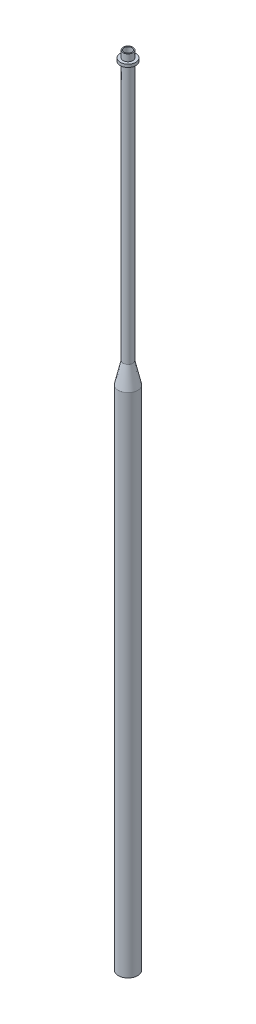
ISO-10303-21;
HEADER;
FILE_DESCRIPTION(('STEP AP214'),'2;1');
FILE_NAME('part.step','',(''),(''),'','','');
FILE_SCHEMA(('AUTOMOTIVE_DESIGN { 1 0 10303 214 1 1 1 1 }'));
ENDSEC;
DATA;
#1=APPLICATION_CONTEXT('core data for automotive mechanical design processes');
#2=APPLICATION_PROTOCOL_DEFINITION('international standard','automotive_design',2000,#1);
#3=PRODUCT_CONTEXT('',#1,'mechanical');
#4=PRODUCT('Part','Part','',(#3));
#5=PRODUCT_RELATED_PRODUCT_CATEGORY('part','',(#4));
#6=PRODUCT_DEFINITION_FORMATION('','',#4);
#7=PRODUCT_DEFINITION_CONTEXT('part definition',#1,'design');
#8=PRODUCT_DEFINITION('design','',#6,#7);
#9=PRODUCT_DEFINITION_SHAPE('','',#8);
#10=(LENGTH_UNIT() NAMED_UNIT(*) SI_UNIT(.MILLI.,.METRE.));
#11=(NAMED_UNIT(*) PLANE_ANGLE_UNIT() SI_UNIT($,.RADIAN.));
#12=(NAMED_UNIT(*) SI_UNIT($,.STERADIAN.) SOLID_ANGLE_UNIT());
#13=UNCERTAINTY_MEASURE_WITH_UNIT(LENGTH_MEASURE(1.E-05),#10,'distance_accuracy_value','');
#14=(GEOMETRIC_REPRESENTATION_CONTEXT(3) GLOBAL_UNCERTAINTY_ASSIGNED_CONTEXT((#13)) GLOBAL_UNIT_ASSIGNED_CONTEXT((#10,
#11,#12)) REPRESENTATION_CONTEXT('',''));
#15=CARTESIAN_POINT('',(0.,0.,0.));
#16=DIRECTION('',(0.,0.,1.));
#17=DIRECTION('',(1.,0.,0.));
#18=AXIS2_PLACEMENT_3D('',#15,#16,#17);
#19=CARTESIAN_POINT('',(0.,820.,0.));
#20=DIRECTION('',(0.,-1.,0.));
#21=DIRECTION('',(0.,0.,-1.));
#22=AXIS2_PLACEMENT_3D('',#19,#20,#21);
#23=CYLINDRICAL_SURFACE('',#22,5.);
#24=CARTESIAN_POINT('',(0.,543.314758742843,0.));
#25=DIRECTION('',(0.,1.,0.));
#26=DIRECTION('',(0.,0.,1.));
#27=AXIS2_PLACEMENT_3D('',#24,#25,#26);
#28=CIRCLE('',#27,5.);
#29=CARTESIAN_POINT('',(0.,543.314758742843,-5.00000000000001));
#30=VERTEX_POINT('',#29);
#31=EDGE_CURVE('E51',#30,#30,#28,.T.);
#32=ORIENTED_EDGE('',*,*,#31,.T.);
#33=EDGE_LOOP('',(#32));
#34=FACE_BOUND('',#33,.T.);
#35=CARTESIAN_POINT('',(0.,810.,0.));
#36=DIRECTION('',(0.,1.,0.));
#37=DIRECTION('',(0.,0.,1.));
#38=AXIS2_PLACEMENT_3D('',#35,#36,#37);
#39=CIRCLE('',#38,5.);
#40=CARTESIAN_POINT('',(0.,810.,5.));
#41=VERTEX_POINT('',#40);
#42=EDGE_CURVE('E10',#41,#41,#39,.T.);
#43=ORIENTED_EDGE('',*,*,#42,.F.);
#44=EDGE_LOOP('',(#43));
#45=FACE_BOUND('',#44,.T.);
#46=ADVANCED_FACE('F37',(#34,#45),#23,.T.);
#47=CARTESIAN_POINT('',(0.,813.,0.));
#48=DIRECTION('',(0.,1.,0.));
#49=DIRECTION('',(0.,0.,1.));
#50=AXIS2_PLACEMENT_3D('',#47,#48,#49);
#51=CIRCLE('',#50,5.);
#52=CARTESIAN_POINT('',(0.,813.,5.));
#53=VERTEX_POINT('',#52);
#54=EDGE_CURVE('E41',#53,#53,#51,.T.);
#55=ORIENTED_EDGE('',*,*,#54,.T.);
#56=EDGE_LOOP('',(#55));
#57=FACE_BOUND('',#56,.T.);
#58=CARTESIAN_POINT('',(0.,820.,0.));
#59=DIRECTION('',(0.,1.,0.));
#60=DIRECTION('',(0.,0.,1.));
#61=AXIS2_PLACEMENT_3D('',#58,#59,#60);
#62=CIRCLE('',#61,5.);
#63=CARTESIAN_POINT('',(0.,820.,5.));
#64=VERTEX_POINT('',#63);
#65=EDGE_CURVE('E57',#64,#64,#62,.T.);
#66=ORIENTED_EDGE('',*,*,#65,.F.);
#67=EDGE_LOOP('',(#66));
#68=FACE_BOUND('',#67,.T.);
#69=ADVANCED_FACE('F86',(#57,#68),#23,.T.);
#70=CARTESIAN_POINT('',(0.,820.,0.));
#71=DIRECTION('',(0.,1.,0.));
#72=DIRECTION('',(0.,0.,1.));
#73=AXIS2_PLACEMENT_3D('',#70,#71,#72);
#74=PLANE('',#73);
#75=CARTESIAN_POINT('',(0.,820.,0.));
#76=DIRECTION('',(0.,1.,0.));
#77=DIRECTION('',(0.,0.,1.));
#78=AXIS2_PLACEMENT_3D('',#75,#76,#77);
#79=CIRCLE('',#78,4.);
#80=CARTESIAN_POINT('',(0.,820.,4.));
#81=VERTEX_POINT('',#80);
#82=EDGE_CURVE('E66',#81,#81,#79,.T.);
#83=ORIENTED_EDGE('',*,*,#82,.F.);
#84=EDGE_LOOP('',(#83));
#85=FACE_BOUND('',#84,.T.);
#86=ORIENTED_EDGE('',*,*,#65,.T.);
#87=EDGE_LOOP('',(#86));
#88=FACE_BOUND('',#87,.T.);
#89=ADVANCED_FACE('F107',(#85,#88),#74,.T.);
#90=CARTESIAN_POINT('',(0.,500.,0.));
#91=DIRECTION('',(0.,-1.,0.));
#92=DIRECTION('',(0.,0.,-1.));
#93=AXIS2_PLACEMENT_3D('',#90,#91,#92);
#94=CYLINDRICAL_SURFACE('',#93,10.);
#95=CARTESIAN_POINT('',(0.,521.657379371422,0.));
#96=DIRECTION('',(0.,-1.,0.));
#97=DIRECTION('',(0.,0.,-1.));
#98=AXIS2_PLACEMENT_3D('',#95,#96,#97);
#99=CIRCLE('',#98,10.);
#100=CARTESIAN_POINT('',(0.,521.657379371422,-9.99999999999998));
#101=VERTEX_POINT('',#100);
#102=EDGE_CURVE('E46',#101,#101,#99,.T.);
#103=ORIENTED_EDGE('',*,*,#102,.T.);
#104=EDGE_LOOP('',(#103));
#105=FACE_BOUND('',#104,.T.);
#106=CARTESIAN_POINT('',(0.,0.,0.));
#107=DIRECTION('',(0.,1.,0.));
#108=DIRECTION('',(0.,0.,1.));
#109=AXIS2_PLACEMENT_3D('',#106,#107,#108);
#110=CIRCLE('',#109,10.);
#111=CARTESIAN_POINT('',(0.,0.,10.));
#112=VERTEX_POINT('',#111);
#113=EDGE_CURVE('E61',#112,#112,#110,.T.);
#114=ORIENTED_EDGE('',*,*,#113,.T.);
#115=EDGE_LOOP('',(#114));
#116=FACE_BOUND('',#115,.T.);
#117=ADVANCED_FACE('F113',(#105,#116),#94,.T.);
#118=CARTESIAN_POINT('',(0.,0.,0.));
#119=DIRECTION('',(0.,1.,0.));
#120=DIRECTION('',(0.,0.,1.));
#121=AXIS2_PLACEMENT_3D('',#118,#119,#120);
#122=PLANE('',#121);
#123=CARTESIAN_POINT('',(0.,0.,0.));
#124=DIRECTION('',(0.,1.,0.));
#125=DIRECTION('',(0.,0.,1.));
#126=AXIS2_PLACEMENT_3D('',#123,#124,#125);
#127=CIRCLE('',#126,4.);
#128=CARTESIAN_POINT('',(0.,0.,4.));
#129=VERTEX_POINT('',#128);
#130=EDGE_CURVE('E65',#129,#129,#127,.T.);
#131=ORIENTED_EDGE('',*,*,#130,.T.);
#132=EDGE_LOOP('',(#131));
#133=FACE_BOUND('',#132,.T.);
#134=ORIENTED_EDGE('',*,*,#113,.F.);
#135=EDGE_LOOP('',(#134));
#136=FACE_BOUND('',#135,.T.);
#137=ADVANCED_FACE('F110',(#133,#136),#122,.F.);
#138=CARTESIAN_POINT('',(0.,543.314758742843,0.));
#139=DIRECTION('',(0.,-1.,0.));
#140=DIRECTION('',(0.,0.,-1.));
#141=AXIS2_PLACEMENT_3D('',#138,#139,#140);
#142=CONICAL_SURFACE('',#141,5.,0.226892802759261);
#143=CARTESIAN_POINT('',(0.,521.657379371422,-9.99999999999998));
#144=CARTESIAN_POINT('',(0.,521.882977073208,-9.94791666666664));
#145=CARTESIAN_POINT('',(0.,522.108574774994,-9.89583333333331));
#146=CARTESIAN_POINT('',(0.,522.559770178565,-9.79166666666665));
#147=CARTESIAN_POINT('',(0.,522.785367880351,-9.73958333333332));
#148=CARTESIAN_POINT('',(0.,523.236563283922,-9.63541666666666));
#149=CARTESIAN_POINT('',(0.,523.462160985707,-9.58333333333332));
#150=CARTESIAN_POINT('',(0.,523.913356389279,-9.47916666666665));
#151=CARTESIAN_POINT('',(0.,524.138954091064,-9.42708333333333));
#152=CARTESIAN_POINT('',(0.,524.590149494636,-9.32291666666666));
#153=CARTESIAN_POINT('',(0.,524.815747196421,-9.27083333333332));
#154=CARTESIAN_POINT('',(0.,525.266942599992,-9.16666666666665));
#155=CARTESIAN_POINT('',(0.,525.492540301778,-9.11458333333333));
#156=CARTESIAN_POINT('',(0.,525.943735705349,-9.01041666666666));
#157=CARTESIAN_POINT('',(0.,526.169333407135,-8.95833333333332));
#158=CARTESIAN_POINT('',(0.,526.620528810706,-8.85416666666665));
#159=CARTESIAN_POINT('',(0.,526.846126512492,-8.80208333333333));
#160=CARTESIAN_POINT('',(0.,527.297321916063,-8.69791666666666));
#161=CARTESIAN_POINT('',(0.,527.522919617849,-8.64583333333332));
#162=CARTESIAN_POINT('',(0.,527.97411502142,-8.54166666666666));
#163=CARTESIAN_POINT('',(0.,528.199712723206,-8.48958333333333));
#164=CARTESIAN_POINT('',(0.,528.650908126777,-8.38541666666666));
#165=CARTESIAN_POINT('',(0.,528.876505828563,-8.33333333333332));
#166=CARTESIAN_POINT('',(0.,529.327701232134,-8.22916666666666));
#167=CARTESIAN_POINT('',(0.,529.55329893392,-8.17708333333333));
#168=CARTESIAN_POINT('',(0.,530.004494337491,-8.07291666666667));
#169=CARTESIAN_POINT('',(0.,530.230092039276,-8.02083333333333));
#170=CARTESIAN_POINT('',(0.,530.681287442848,-7.91666666666666));
#171=CARTESIAN_POINT('',(0.,530.906885144633,-7.86458333333333));
#172=CARTESIAN_POINT('',(0.,531.358080548205,-7.76041666666667));
#173=CARTESIAN_POINT('',(0.,531.58367824999,-7.70833333333333));
#174=CARTESIAN_POINT('',(0.,532.034873653561,-7.60416666666666));
#175=CARTESIAN_POINT('',(0.,532.260471355347,-7.55208333333333));
#176=CARTESIAN_POINT('',(0.,532.711666758918,-7.44791666666667));
#177=CARTESIAN_POINT('',(0.,532.937264460704,-7.39583333333334));
#178=CARTESIAN_POINT('',(0.,533.388459864275,-7.29166666666667));
#179=CARTESIAN_POINT('',(0.,533.614057566061,-7.23958333333333));
#180=CARTESIAN_POINT('',(0.,534.065252969632,-7.13541666666666));
#181=CARTESIAN_POINT('',(0.,534.290850671418,-7.08333333333334));
#182=CARTESIAN_POINT('',(0.,534.742046074989,-6.97916666666667));
#183=CARTESIAN_POINT('',(0.,534.967643776775,-6.92708333333333));
#184=CARTESIAN_POINT('',(0.,535.418839180346,-6.82291666666666));
#185=CARTESIAN_POINT('',(0.,535.644436882132,-6.77083333333334));
#186=CARTESIAN_POINT('',(0.,536.095632285703,-6.66666666666667));
#187=CARTESIAN_POINT('',(0.,536.321229987489,-6.61458333333333));
#188=CARTESIAN_POINT('',(0.,536.77242539106,-6.51041666666667));
#189=CARTESIAN_POINT('',(0.,536.998023092846,-6.45833333333334));
#190=CARTESIAN_POINT('',(0.,537.449218496417,-6.35416666666668));
#191=CARTESIAN_POINT('',(0.,537.674816198202,-6.30208333333333));
#192=CARTESIAN_POINT('',(0.,538.126011601774,-6.19791666666667));
#193=CARTESIAN_POINT('',(0.,538.351609303559,-6.14583333333334));
#194=CARTESIAN_POINT('',(0.,538.802804707131,-6.04166666666668));
#195=CARTESIAN_POINT('',(0.,539.028402408916,-5.98958333333334));
#196=CARTESIAN_POINT('',(0.,539.479597812487,-5.88541666666667));
#197=CARTESIAN_POINT('',(0.,539.705195514273,-5.83333333333334));
#198=CARTESIAN_POINT('',(0.,540.156390917844,-5.72916666666668));
#199=CARTESIAN_POINT('',(0.,540.38198861963,-5.67708333333334));
#200=CARTESIAN_POINT('',(0.,540.833184023201,-5.57291666666667));
#201=CARTESIAN_POINT('',(0.,541.058781724987,-5.52083333333335));
#202=CARTESIAN_POINT('',(0.,541.509977128558,-5.41666666666668));
#203=CARTESIAN_POINT('',(0.,541.735574830344,-5.36458333333334));
#204=CARTESIAN_POINT('',(0.,542.186770233915,-5.26041666666667));
#205=CARTESIAN_POINT('',(0.,542.412367935701,-5.20833333333334));
#206=CARTESIAN_POINT('',(0.,542.863563339272,-5.10416666666668));
#207=CARTESIAN_POINT('',(0.,543.089161041058,-5.05208333333335));
#208=CARTESIAN_POINT('',(0.,543.314758742843,-5.00000000000001));
#209=B_SPLINE_CURVE_WITH_KNOTS('',3,(#143,#144,#145,#146,#147,#148,#149,#150,#151,#152,#153,
#154,#155,#156,#157,#158,#159,#160,#161,#162,#163,#164,#165,#166,#167,#168,#169,#170,#171,#172,
#173,#174,#175,#176,#177,#178,#179,#180,#181,#182,#183,#184,#185,#186,#187,#188,#189,#190,#191,
#192,#193,#194,#195,#196,#197,#198,#199,#200,#201,#202,#203,#204,#205,#206,#207,#208),
.UNSPECIFIED.,.F.,.F.,(4,2,2,2,2,2,2,2,2,2,2,2,2,2,2,2,2,2,2,2,2,2,2,2,2,2,2,2,2,2,2,2,4),(0.,
0.694595544153977,1.38919108830806,2.08378663246204,2.77838217661612,3.4729777207701,
4.16757326492418,4.86216880907816,5.55676435323225,6.25135989738622,6.94595544154031,
7.64055098569428,8.33514652984837,9.02974207400234,9.72433761815643,10.4189331623104,
11.1135287064645,11.8081242506186,12.5027197947725,13.1973153389266,13.8919108830806,
14.5865064272347,15.2811019713887,15.9756975155428,16.6702930596967,17.3648886038508,
18.0594841480048,18.7540796921589,19.4486752363129,20.1432707804669,20.8378663246209,
21.532461868775,22.2270574129291),.UNSPECIFIED.);
#210=EDGE_CURVE('BSEAM39',#101,#30,#209,.T.);
#211=ORIENTED_EDGE('',*,*,#102,.F.);
#212=ORIENTED_EDGE('',*,*,#31,.F.);
#213=ORIENTED_EDGE('',*,*,#210,.T.);
#214=ORIENTED_EDGE('',*,*,#210,.F.);
#215=EDGE_LOOP('',(#211,#213,#212,#214));
#216=FACE_BOUND('',#215,.T.);
#217=ADVANCED_FACE('F39',(#216),#142,.T.);
#218=CARTESIAN_POINT('',(0.,0.,0.));
#219=DIRECTION('',(0.,1.,0.));
#220=DIRECTION('',(0.,0.,1.));
#221=AXIS2_PLACEMENT_3D('',#218,#219,#220);
#222=CYLINDRICAL_SURFACE('',#221,4.);
#223=ORIENTED_EDGE('',*,*,#130,.F.);
#224=EDGE_LOOP('',(#223));
#225=FACE_BOUND('',#224,.T.);
#226=ORIENTED_EDGE('',*,*,#82,.T.);
#227=EDGE_LOOP('',(#226));
#228=FACE_BOUND('',#227,.T.);
#229=ADVANCED_FACE('F92',(#225,#228),#222,.F.);
#230=CARTESIAN_POINT('',(0.,813.,0.));
#231=DIRECTION('',(0.,1.,0.));
#232=DIRECTION('',(0.,0.,1.));
#233=AXIS2_PLACEMENT_3D('',#230,#231,#232);
#234=PLANE('',#233);
#235=ORIENTED_EDGE('',*,*,#54,.F.);
#236=EDGE_LOOP('',(#235));
#237=FACE_BOUND('',#236,.T.);
#238=CARTESIAN_POINT('',(0.,813.,0.));
#239=DIRECTION('',(0.,1.,0.));
#240=DIRECTION('',(0.,0.,1.));
#241=AXIS2_PLACEMENT_3D('',#238,#239,#240);
#242=CIRCLE('',#241,8.);
#243=CARTESIAN_POINT('',(0.,813.,8.));
#244=VERTEX_POINT('',#243);
#245=EDGE_CURVE('E77',#244,#244,#242,.T.);
#246=ORIENTED_EDGE('',*,*,#245,.T.);
#247=EDGE_LOOP('',(#246));
#248=FACE_BOUND('',#247,.T.);
#249=ADVANCED_FACE('F89',(#237,#248),#234,.T.);
#250=CARTESIAN_POINT('',(0.,810.,0.));
#251=DIRECTION('',(0.,1.,0.));
#252=DIRECTION('',(0.,0.,1.));
#253=AXIS2_PLACEMENT_3D('',#250,#251,#252);
#254=PLANE('',#253);
#255=ORIENTED_EDGE('',*,*,#42,.T.);
#256=EDGE_LOOP('',(#255));
#257=FACE_BOUND('',#256,.T.);
#258=CARTESIAN_POINT('',(0.,810.,0.));
#259=DIRECTION('',(0.,1.,0.));
#260=DIRECTION('',(0.,0.,1.));
#261=AXIS2_PLACEMENT_3D('',#258,#259,#260);
#262=CIRCLE('',#261,8.);
#263=CARTESIAN_POINT('',(0.,810.,8.));
#264=VERTEX_POINT('',#263);
#265=EDGE_CURVE('E73',#264,#264,#262,.T.);
#266=ORIENTED_EDGE('',*,*,#265,.F.);
#267=EDGE_LOOP('',(#266));
#268=FACE_BOUND('',#267,.T.);
#269=ADVANCED_FACE('F91',(#257,#268),#254,.F.);
#270=CARTESIAN_POINT('',(0.,813.,0.));
#271=DIRECTION('',(0.,-1.,0.));
#272=DIRECTION('',(0.,0.,-1.));
#273=AXIS2_PLACEMENT_3D('',#270,#271,#272);
#274=CYLINDRICAL_SURFACE('',#273,8.);
#275=ORIENTED_EDGE('',*,*,#245,.F.);
#276=EDGE_LOOP('',(#275));
#277=FACE_BOUND('',#276,.T.);
#278=ORIENTED_EDGE('',*,*,#265,.T.);
#279=EDGE_LOOP('',(#278));
#280=FACE_BOUND('',#279,.T.);
#281=ADVANCED_FACE('F98',(#277,#280),#274,.T.);
#282=CLOSED_SHELL('',(#46,#69,#89,#117,#137,#217,#229,#249,#269,#281));
#283=MANIFOLD_SOLID_BREP('B2',#282);
#284=ADVANCED_BREP_SHAPE_REPRESENTATION('',(#18,#283),#14);
#285=SHAPE_DEFINITION_REPRESENTATION(#9,#284);
ENDSEC;
END-ISO-10303-21;
